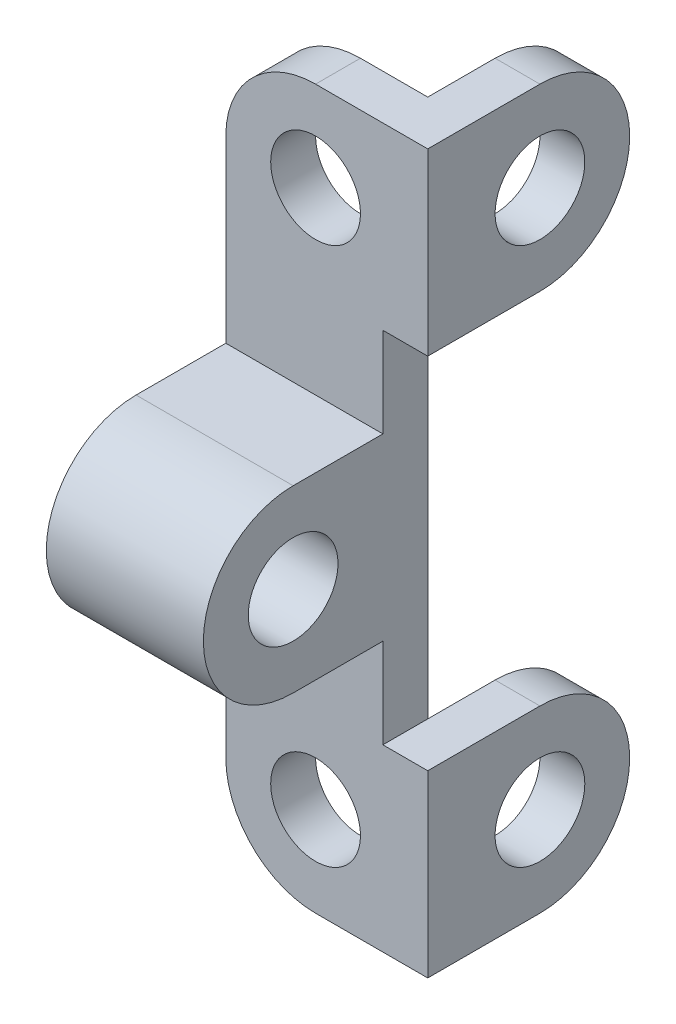
ISO-10303-21;
HEADER;
FILE_DESCRIPTION(('STEP AP214'),'2;1');
FILE_NAME('part.step','',(''),(''),'','','');
FILE_SCHEMA(('AUTOMOTIVE_DESIGN { 1 0 10303 214 1 1 1 1 }'));
ENDSEC;
DATA;
#1=APPLICATION_CONTEXT('core data for automotive mechanical design processes');
#2=APPLICATION_PROTOCOL_DEFINITION('international standard','automotive_design',2000,#1);
#3=PRODUCT_CONTEXT('',#1,'mechanical');
#4=PRODUCT('Part','Part','',(#3));
#5=PRODUCT_RELATED_PRODUCT_CATEGORY('part','',(#4));
#6=PRODUCT_DEFINITION_FORMATION('','',#4);
#7=PRODUCT_DEFINITION_CONTEXT('part definition',#1,'design');
#8=PRODUCT_DEFINITION('design','',#6,#7);
#9=PRODUCT_DEFINITION_SHAPE('','',#8);
#10=(LENGTH_UNIT() NAMED_UNIT(*) SI_UNIT(.MILLI.,.METRE.));
#11=(NAMED_UNIT(*) PLANE_ANGLE_UNIT() SI_UNIT($,.RADIAN.));
#12=(NAMED_UNIT(*) SI_UNIT($,.STERADIAN.) SOLID_ANGLE_UNIT());
#13=UNCERTAINTY_MEASURE_WITH_UNIT(LENGTH_MEASURE(1.E-05),#10,'distance_accuracy_value','');
#14=(GEOMETRIC_REPRESENTATION_CONTEXT(3) GLOBAL_UNCERTAINTY_ASSIGNED_CONTEXT((#13)) GLOBAL_UNIT_ASSIGNED_CONTEXT((#10,
#11,#12)) REPRESENTATION_CONTEXT('',''));
#15=CARTESIAN_POINT('',(0.,0.,0.));
#16=DIRECTION('',(0.,0.,1.));
#17=DIRECTION('',(1.,0.,0.));
#18=AXIS2_PLACEMENT_3D('',#15,#16,#17);
#19=CARTESIAN_POINT('',(-20.,0.,-30.));
#20=DIRECTION('',(0.,0.,-1.));
#21=DIRECTION('',(-1.,0.,0.));
#22=AXIS2_PLACEMENT_3D('',#19,#20,#21);
#23=PLANE('',#22);
#24=CARTESIAN_POINT('',(0.,-60.,-30.));
#25=DIRECTION('',(0.,0.,-1.));
#26=DIRECTION('',(-1.,0.,0.));
#27=AXIS2_PLACEMENT_3D('',#24,#25,#26);
#28=CIRCLE('',#27,10.);
#29=CARTESIAN_POINT('',(-10.,-60.,-30.));
#30=VERTEX_POINT('',#29);
#31=EDGE_CURVE('E314',#30,#30,#28,.T.);
#32=ORIENTED_EDGE('',*,*,#31,.F.);
#33=EDGE_LOOP('',(#32));
#34=FACE_BOUND('',#33,.T.);
#35=CARTESIAN_POINT('',(0.,60.,-30.));
#36=DIRECTION('',(0.,0.,-1.));
#37=DIRECTION('',(-1.,0.,0.));
#38=AXIS2_PLACEMENT_3D('',#35,#36,#37);
#39=CIRCLE('',#38,10.);
#40=CARTESIAN_POINT('',(-10.,60.,-30.));
#41=VERTEX_POINT('',#40);
#42=EDGE_CURVE('E203',#41,#41,#39,.T.);
#43=ORIENTED_EDGE('',*,*,#42,.F.);
#44=EDGE_LOOP('',(#43));
#45=FACE_BOUND('',#44,.T.);
#46=DIRECTION('',(0.,1.,0.));
#47=VECTOR('',#46,1.);
#48=CARTESIAN_POINT('',(15.,0.,-30.));
#49=LINE('',#48,#47);
#50=CARTESIAN_POINT('',(15.,-40.,-30.));
#51=VERTEX_POINT('',#50);
#52=CARTESIAN_POINT('',(15.,40.,-30.));
#53=VERTEX_POINT('',#52);
#54=EDGE_CURVE('E280',#51,#53,#49,.T.);
#55=ORIENTED_EDGE('',*,*,#54,.F.);
#56=DIRECTION('',(0.,-1.,0.));
#57=VECTOR('',#56,1.);
#58=CARTESIAN_POINT('',(15.,0.,-30.));
#59=LINE('',#58,#57);
#60=CARTESIAN_POINT('',(15.,-80.,-30.));
#61=VERTEX_POINT('',#60);
#62=EDGE_CURVE('E194',#51,#61,#59,.T.);
#63=ORIENTED_EDGE('',*,*,#62,.T.);
#64=DIRECTION('',(1.,0.,0.));
#65=VECTOR('',#64,1.);
#66=CARTESIAN_POINT('',(-20.,-80.,-30.));
#67=LINE('',#66,#65);
#68=CARTESIAN_POINT('',(0.,-80.,-30.));
#69=VERTEX_POINT('',#68);
#70=EDGE_CURVE('E169',#69,#61,#67,.T.);
#71=ORIENTED_EDGE('',*,*,#70,.F.);
#72=CARTESIAN_POINT('',(0.,-60.,-30.));
#73=DIRECTION('',(0.,0.,-1.));
#74=DIRECTION('',(-1.,0.,0.));
#75=AXIS2_PLACEMENT_3D('',#72,#73,#74);
#76=CIRCLE('',#75,20.);
#77=CARTESIAN_POINT('',(-20.,-60.,-30.));
#78=VERTEX_POINT('',#77);
#79=EDGE_CURVE('E308',#69,#78,#76,.T.);
#80=ORIENTED_EDGE('',*,*,#79,.T.);
#81=DIRECTION('',(0.,1.,0.));
#82=VECTOR('',#81,1.);
#83=CARTESIAN_POINT('',(-20.,0.,-30.));
#84=LINE('',#83,#82);
#85=CARTESIAN_POINT('',(-20.,60.,-30.));
#86=VERTEX_POINT('',#85);
#87=EDGE_CURVE('E285',#78,#86,#84,.T.);
#88=ORIENTED_EDGE('',*,*,#87,.T.);
#89=CARTESIAN_POINT('',(0.,60.,-30.));
#90=DIRECTION('',(0.,0.,-1.));
#91=DIRECTION('',(-1.,0.,0.));
#92=AXIS2_PLACEMENT_3D('',#89,#90,#91);
#93=CIRCLE('',#92,20.);
#94=CARTESIAN_POINT('',(0.,80.,-30.));
#95=VERTEX_POINT('',#94);
#96=EDGE_CURVE('E310',#86,#95,#93,.T.);
#97=ORIENTED_EDGE('',*,*,#96,.T.);
#98=DIRECTION('',(1.,0.,0.));
#99=VECTOR('',#98,1.);
#100=CARTESIAN_POINT('',(-20.,80.,-30.));
#101=LINE('',#100,#99);
#102=CARTESIAN_POINT('',(15.,80.,-30.));
#103=VERTEX_POINT('',#102);
#104=EDGE_CURVE('E291',#95,#103,#101,.T.);
#105=ORIENTED_EDGE('',*,*,#104,.T.);
#106=DIRECTION('',(0.,1.,0.));
#107=VECTOR('',#106,1.);
#108=CARTESIAN_POINT('',(15.,0.,-30.));
#109=LINE('',#108,#107);
#110=EDGE_CURVE('E222',#53,#103,#109,.T.);
#111=ORIENTED_EDGE('',*,*,#110,.F.);
#112=EDGE_LOOP('',(#55,#63,#71,#80,#88,#97,#105,#111));
#113=FACE_BOUND('',#112,.T.);
#114=ADVANCED_FACE('F39',(#34,#45,#113),#23,.T.);
#115=CARTESIAN_POINT('',(-20.,0.,-20.));
#116=DIRECTION('',(0.,0.,-1.));
#117=DIRECTION('',(-1.,0.,0.));
#118=AXIS2_PLACEMENT_3D('',#115,#116,#117);
#119=PLANE('',#118);
#120=CARTESIAN_POINT('',(0.,60.,-20.));
#121=DIRECTION('',(0.,0.,-1.));
#122=DIRECTION('',(-1.,0.,0.));
#123=AXIS2_PLACEMENT_3D('',#120,#121,#122);
#124=CIRCLE('',#123,10.);
#125=CARTESIAN_POINT('',(-10.,60.,-20.));
#126=VERTEX_POINT('',#125);
#127=EDGE_CURVE('E43',#126,#126,#124,.T.);
#128=ORIENTED_EDGE('',*,*,#127,.T.);
#129=EDGE_LOOP('',(#128));
#130=FACE_BOUND('',#129,.T.);
#131=DIRECTION('',(0.,1.,0.));
#132=VECTOR('',#131,1.);
#133=CARTESIAN_POINT('',(15.,0.,-20.));
#134=LINE('',#133,#132);
#135=CARTESIAN_POINT('',(15.,20.,-20.));
#136=VERTEX_POINT('',#135);
#137=CARTESIAN_POINT('',(15.,40.,-20.));
#138=VERTEX_POINT('',#137);
#139=EDGE_CURVE('E282',#136,#138,#134,.T.);
#140=ORIENTED_EDGE('',*,*,#139,.T.);
#141=DIRECTION('',(-1.,0.,0.));
#142=VECTOR('',#141,1.);
#143=CARTESIAN_POINT('',(25.,40.,-20.));
#144=LINE('',#143,#142);
#145=CARTESIAN_POINT('',(25.,40.,-20.));
#146=VERTEX_POINT('',#145);
#147=EDGE_CURVE('E224',#146,#138,#144,.T.);
#148=ORIENTED_EDGE('',*,*,#147,.F.);
#149=DIRECTION('',(0.,-1.,0.));
#150=VECTOR('',#149,1.);
#151=CARTESIAN_POINT('',(25.,80.,-20.));
#152=LINE('',#151,#150);
#153=CARTESIAN_POINT('',(25.,80.,-20.));
#154=VERTEX_POINT('',#153);
#155=EDGE_CURVE('E245',#154,#146,#152,.T.);
#156=ORIENTED_EDGE('',*,*,#155,.F.);
#157=DIRECTION('',(1.,0.,0.));
#158=VECTOR('',#157,1.);
#159=CARTESIAN_POINT('',(-20.,80.,-20.));
#160=LINE('',#159,#158);
#161=CARTESIAN_POINT('',(0.,80.,-20.));
#162=VERTEX_POINT('',#161);
#163=EDGE_CURVE('E296',#162,#154,#160,.T.);
#164=ORIENTED_EDGE('',*,*,#163,.F.);
#165=CARTESIAN_POINT('',(0.,60.,-20.));
#166=DIRECTION('',(0.,0.,-1.));
#167=DIRECTION('',(-1.,0.,0.));
#168=AXIS2_PLACEMENT_3D('',#165,#166,#167);
#169=CIRCLE('',#168,20.);
#170=CARTESIAN_POINT('',(-20.,60.,-20.));
#171=VERTEX_POINT('',#170);
#172=EDGE_CURVE('E302',#162,#171,#169,.F.);
#173=ORIENTED_EDGE('',*,*,#172,.T.);
#174=DIRECTION('',(0.,1.,0.));
#175=VECTOR('',#174,1.);
#176=CARTESIAN_POINT('',(-20.,0.,-20.));
#177=LINE('',#176,#175);
#178=CARTESIAN_POINT('',(-20.,20.,-20.));
#179=VERTEX_POINT('',#178);
#180=EDGE_CURVE('E288',#179,#171,#177,.T.);
#181=ORIENTED_EDGE('',*,*,#180,.F.);
#182=DIRECTION('',(-1.,0.,0.));
#183=VECTOR('',#182,1.);
#184=CARTESIAN_POINT('',(15.,20.,-20.));
#185=LINE('',#184,#183);
#186=EDGE_CURVE('E271',#136,#179,#185,.T.);
#187=ORIENTED_EDGE('',*,*,#186,.F.);
#188=EDGE_LOOP('',(#140,#148,#156,#164,#173,#181,#187));
#189=FACE_BOUND('',#188,.T.);
#190=ADVANCED_FACE('F349',(#130,#189),#119,.F.);
#191=CARTESIAN_POINT('',(0.,-60.,-20.));
#192=DIRECTION('',(0.,0.,-1.));
#193=DIRECTION('',(-1.,0.,0.));
#194=AXIS2_PLACEMENT_3D('',#191,#192,#193);
#195=CIRCLE('',#194,10.);
#196=CARTESIAN_POINT('',(-10.,-60.,-20.));
#197=VERTEX_POINT('',#196);
#198=EDGE_CURVE('E312',#197,#197,#195,.T.);
#199=ORIENTED_EDGE('',*,*,#198,.T.);
#200=EDGE_LOOP('',(#199));
#201=FACE_BOUND('',#200,.T.);
#202=DIRECTION('',(-1.,0.,0.));
#203=VECTOR('',#202,1.);
#204=CARTESIAN_POINT('',(25.,-40.,-20.));
#205=LINE('',#204,#203);
#206=CARTESIAN_POINT('',(25.,-40.,-20.));
#207=VERTEX_POINT('',#206);
#208=CARTESIAN_POINT('',(15.,-40.,-20.));
#209=VERTEX_POINT('',#208);
#210=EDGE_CURVE('E233',#207,#209,#205,.T.);
#211=ORIENTED_EDGE('',*,*,#210,.T.);
#212=CARTESIAN_POINT('',(15.,-20.,-20.));
#213=VERTEX_POINT('',#212);
#214=EDGE_CURVE('E283',#209,#213,#134,.T.);
#215=ORIENTED_EDGE('',*,*,#214,.T.);
#216=DIRECTION('',(-1.,0.,0.));
#217=VECTOR('',#216,1.);
#218=CARTESIAN_POINT('',(15.,-20.,-20.));
#219=LINE('',#218,#217);
#220=CARTESIAN_POINT('',(-20.,-20.,-20.));
#221=VERTEX_POINT('',#220);
#222=EDGE_CURVE('E273',#213,#221,#219,.T.);
#223=ORIENTED_EDGE('',*,*,#222,.T.);
#224=CARTESIAN_POINT('',(-20.,-60.,-20.));
#225=VERTEX_POINT('',#224);
#226=EDGE_CURVE('E289',#225,#221,#177,.T.);
#227=ORIENTED_EDGE('',*,*,#226,.F.);
#228=CARTESIAN_POINT('',(0.,-60.,-20.));
#229=DIRECTION('',(0.,0.,-1.));
#230=DIRECTION('',(-1.,0.,0.));
#231=AXIS2_PLACEMENT_3D('',#228,#229,#230);
#232=CIRCLE('',#231,20.);
#233=CARTESIAN_POINT('',(0.,-80.,-20.));
#234=VERTEX_POINT('',#233);
#235=EDGE_CURVE('E11',#225,#234,#232,.F.);
#236=ORIENTED_EDGE('',*,*,#235,.T.);
#237=DIRECTION('',(1.,0.,0.));
#238=VECTOR('',#237,1.);
#239=CARTESIAN_POINT('',(-20.,-80.,-20.));
#240=LINE('',#239,#238);
#241=CARTESIAN_POINT('',(25.,-80.,-20.));
#242=VERTEX_POINT('',#241);
#243=EDGE_CURVE('E294',#234,#242,#240,.T.);
#244=ORIENTED_EDGE('',*,*,#243,.T.);
#245=DIRECTION('',(0.,-1.,0.));
#246=VECTOR('',#245,1.);
#247=CARTESIAN_POINT('',(25.,-80.,-20.));
#248=LINE('',#247,#246);
#249=EDGE_CURVE('E230',#207,#242,#248,.T.);
#250=ORIENTED_EDGE('',*,*,#249,.F.);
#251=EDGE_LOOP('',(#211,#215,#223,#227,#236,#244,#250));
#252=FACE_BOUND('',#251,.T.);
#253=ADVANCED_FACE('F356',(#201,#252),#119,.F.);
#254=CARTESIAN_POINT('',(-20.,-80.,0.));
#255=DIRECTION('',(0.,-1.,0.));
#256=DIRECTION('',(0.,0.,-1.));
#257=AXIS2_PLACEMENT_3D('',#254,#255,#256);
#258=PLANE('',#257);
#259=DIRECTION('',(0.,0.,-1.));
#260=VECTOR('',#259,1.);
#261=CARTESIAN_POINT('',(25.,-80.,-20.));
#262=LINE('',#261,#260);
#263=CARTESIAN_POINT('',(25.,-80.,-45.));
#264=VERTEX_POINT('',#263);
#265=EDGE_CURVE('E225',#242,#264,#262,.T.);
#266=ORIENTED_EDGE('',*,*,#265,.F.);
#267=ORIENTED_EDGE('',*,*,#243,.F.);
#268=DIRECTION('',(0.,0.,-1.));
#269=VECTOR('',#268,1.);
#270=CARTESIAN_POINT('',(0.,-80.,-30.));
#271=LINE('',#270,#269);
#272=EDGE_CURVE('E48',#234,#69,#271,.T.);
#273=ORIENTED_EDGE('',*,*,#272,.T.);
#274=ORIENTED_EDGE('',*,*,#70,.T.);
#275=DIRECTION('',(0.,0.,-1.));
#276=VECTOR('',#275,1.);
#277=CARTESIAN_POINT('',(15.,-80.,-45.));
#278=LINE('',#277,#276);
#279=CARTESIAN_POINT('',(15.,-80.,-45.));
#280=VERTEX_POINT('',#279);
#281=EDGE_CURVE('E161',#61,#280,#278,.T.);
#282=ORIENTED_EDGE('',*,*,#281,.T.);
#283=DIRECTION('',(1.,0.,0.));
#284=VECTOR('',#283,1.);
#285=CARTESIAN_POINT('',(15.,-80.,-45.));
#286=LINE('',#285,#284);
#287=EDGE_CURVE('E165',#280,#264,#286,.T.);
#288=ORIENTED_EDGE('',*,*,#287,.T.);
#289=EDGE_LOOP('',(#266,#267,#273,#274,#282,#288));
#290=FACE_BOUND('',#289,.T.);
#291=ADVANCED_FACE('F164',(#290),#258,.T.);
#292=CARTESIAN_POINT('',(-20.,80.,0.));
#293=DIRECTION('',(0.,1.,0.));
#294=DIRECTION('',(0.,0.,1.));
#295=AXIS2_PLACEMENT_3D('',#292,#293,#294);
#296=PLANE('',#295);
#297=ORIENTED_EDGE('',*,*,#163,.T.);
#298=DIRECTION('',(0.,0.,1.));
#299=VECTOR('',#298,1.);
#300=CARTESIAN_POINT('',(25.,80.,-20.));
#301=LINE('',#300,#299);
#302=CARTESIAN_POINT('',(25.,80.,-45.));
#303=VERTEX_POINT('',#302);
#304=EDGE_CURVE('E243',#303,#154,#301,.T.);
#305=ORIENTED_EDGE('',*,*,#304,.F.);
#306=DIRECTION('',(1.,0.,0.));
#307=VECTOR('',#306,1.);
#308=CARTESIAN_POINT('',(15.,80.,-45.));
#309=LINE('',#308,#307);
#310=CARTESIAN_POINT('',(15.,80.,-45.));
#311=VERTEX_POINT('',#310);
#312=EDGE_CURVE('E196',#311,#303,#309,.T.);
#313=ORIENTED_EDGE('',*,*,#312,.F.);
#314=DIRECTION('',(0.,0.,1.));
#315=VECTOR('',#314,1.);
#316=CARTESIAN_POINT('',(15.,80.,-45.));
#317=LINE('',#316,#315);
#318=EDGE_CURVE('E210',#311,#103,#317,.T.);
#319=ORIENTED_EDGE('',*,*,#318,.T.);
#320=ORIENTED_EDGE('',*,*,#104,.F.);
#321=DIRECTION('',(0.,0.,1.));
#322=VECTOR('',#321,1.);
#323=CARTESIAN_POINT('',(0.,80.,-20.));
#324=LINE('',#323,#322);
#325=EDGE_CURVE('E293',#95,#162,#324,.T.);
#326=ORIENTED_EDGE('',*,*,#325,.T.);
#327=EDGE_LOOP('',(#297,#305,#313,#319,#320,#326));
#328=FACE_BOUND('',#327,.T.);
#329=ADVANCED_FACE('F361',(#328),#296,.T.);
#330=CARTESIAN_POINT('',(-20.,0.,0.));
#331=DIRECTION('',(1.,0.,0.));
#332=DIRECTION('',(0.,0.,-1.));
#333=AXIS2_PLACEMENT_3D('',#330,#331,#332);
#334=PLANE('',#333);
#335=ORIENTED_EDGE('',*,*,#180,.T.);
#336=DIRECTION('',(0.,0.,1.));
#337=VECTOR('',#336,1.);
#338=CARTESIAN_POINT('',(-20.,60.,-30.));
#339=LINE('',#338,#337);
#340=EDGE_CURVE('E306',#171,#86,#339,.F.);
#341=ORIENTED_EDGE('',*,*,#340,.T.);
#342=ORIENTED_EDGE('',*,*,#87,.F.);
#343=DIRECTION('',(0.,0.,-1.));
#344=VECTOR('',#343,1.);
#345=CARTESIAN_POINT('',(-20.,-60.,-20.));
#346=LINE('',#345,#344);
#347=EDGE_CURVE('E304',#78,#225,#346,.F.);
#348=ORIENTED_EDGE('',*,*,#347,.T.);
#349=ORIENTED_EDGE('',*,*,#226,.T.);
#350=DIRECTION('',(0.,0.,-1.));
#351=VECTOR('',#350,1.);
#352=CARTESIAN_POINT('',(-20.,-20.,0.));
#353=LINE('',#352,#351);
#354=CARTESIAN_POINT('',(-20.,-20.,0.));
#355=VERTEX_POINT('',#354);
#356=EDGE_CURVE('E257',#355,#221,#353,.T.);
#357=ORIENTED_EDGE('',*,*,#356,.F.);
#358=CARTESIAN_POINT('',(-20.,0.,0.));
#359=DIRECTION('',(1.,0.,0.));
#360=DIRECTION('',(0.,0.,-1.));
#361=AXIS2_PLACEMENT_3D('',#358,#359,#360);
#362=CIRCLE('',#361,20.);
#363=CARTESIAN_POINT('',(-20.,20.,0.));
#364=VERTEX_POINT('',#363);
#365=EDGE_CURVE('E254',#364,#355,#362,.T.);
#366=ORIENTED_EDGE('',*,*,#365,.F.);
#367=DIRECTION('',(0.,0.,1.));
#368=VECTOR('',#367,1.);
#369=CARTESIAN_POINT('',(-20.,20.,0.));
#370=LINE('',#369,#368);
#371=EDGE_CURVE('E251',#179,#364,#370,.T.);
#372=ORIENTED_EDGE('',*,*,#371,.F.);
#373=EDGE_LOOP('',(#335,#341,#342,#348,#349,#357,#366,#372));
#374=FACE_BOUND('',#373,.T.);
#375=CARTESIAN_POINT('',(-20.,0.,0.));
#376=DIRECTION('',(1.,0.,0.));
#377=DIRECTION('',(0.,0.,-1.));
#378=AXIS2_PLACEMENT_3D('',#375,#376,#377);
#379=CIRCLE('',#378,10.);
#380=CARTESIAN_POINT('',(-20.,0.,-10.));
#381=VERTEX_POINT('',#380);
#382=EDGE_CURVE('E238',#381,#381,#379,.T.);
#383=ORIENTED_EDGE('',*,*,#382,.T.);
#384=EDGE_LOOP('',(#383));
#385=FACE_BOUND('',#384,.T.);
#386=ADVANCED_FACE('F402',(#374,#385),#334,.F.);
#387=CARTESIAN_POINT('',(15.,0.,0.));
#388=DIRECTION('',(1.,0.,0.));
#389=DIRECTION('',(0.,0.,-1.));
#390=AXIS2_PLACEMENT_3D('',#387,#388,#389);
#391=PLANE('',#390);
#392=DIRECTION('',(0.,0.,1.));
#393=VECTOR('',#392,1.);
#394=CARTESIAN_POINT('',(15.,-40.,-20.));
#395=LINE('',#394,#393);
#396=EDGE_CURVE('E228',#51,#209,#395,.T.);
#397=ORIENTED_EDGE('',*,*,#396,.F.);
#398=ORIENTED_EDGE('',*,*,#54,.T.);
#399=DIRECTION('',(0.,0.,-1.));
#400=VECTOR('',#399,1.);
#401=CARTESIAN_POINT('',(15.,40.,-20.));
#402=LINE('',#401,#400);
#403=EDGE_CURVE('E56',#138,#53,#402,.T.);
#404=ORIENTED_EDGE('',*,*,#403,.F.);
#405=ORIENTED_EDGE('',*,*,#139,.F.);
#406=DIRECTION('',(0.,0.,1.));
#407=VECTOR('',#406,1.);
#408=CARTESIAN_POINT('',(15.,20.,0.));
#409=LINE('',#408,#407);
#410=CARTESIAN_POINT('',(15.,20.,0.));
#411=VERTEX_POINT('',#410);
#412=EDGE_CURVE('E263',#136,#411,#409,.T.);
#413=ORIENTED_EDGE('',*,*,#412,.T.);
#414=CARTESIAN_POINT('',(15.,0.,0.));
#415=DIRECTION('',(1.,0.,0.));
#416=DIRECTION('',(0.,0.,-1.));
#417=AXIS2_PLACEMENT_3D('',#414,#415,#416);
#418=CIRCLE('',#417,20.);
#419=CARTESIAN_POINT('',(15.,-20.,0.));
#420=VERTEX_POINT('',#419);
#421=EDGE_CURVE('E266',#411,#420,#418,.T.);
#422=ORIENTED_EDGE('',*,*,#421,.T.);
#423=DIRECTION('',(0.,0.,-1.));
#424=VECTOR('',#423,1.);
#425=CARTESIAN_POINT('',(15.,-20.,0.));
#426=LINE('',#425,#424);
#427=EDGE_CURVE('E268',#420,#213,#426,.T.);
#428=ORIENTED_EDGE('',*,*,#427,.T.);
#429=ORIENTED_EDGE('',*,*,#214,.F.);
#430=EDGE_LOOP('',(#397,#398,#404,#405,#413,#422,#428,#429));
#431=FACE_BOUND('',#430,.T.);
#432=CARTESIAN_POINT('',(15.,0.,0.));
#433=DIRECTION('',(1.,0.,0.));
#434=DIRECTION('',(0.,0.,-1.));
#435=AXIS2_PLACEMENT_3D('',#432,#433,#434);
#436=CIRCLE('',#435,10.);
#437=CARTESIAN_POINT('',(15.,0.,-10.));
#438=VERTEX_POINT('',#437);
#439=EDGE_CURVE('E260',#438,#438,#436,.T.);
#440=ORIENTED_EDGE('',*,*,#439,.F.);
#441=EDGE_LOOP('',(#440));
#442=FACE_BOUND('',#441,.T.);
#443=ADVANCED_FACE('F394',(#431,#442),#391,.T.);
#444=CARTESIAN_POINT('',(15.,20.,0.));
#445=DIRECTION('',(0.,-1.,0.));
#446=DIRECTION('',(0.,0.,-1.));
#447=AXIS2_PLACEMENT_3D('',#444,#445,#446);
#448=PLANE('',#447);
#449=ORIENTED_EDGE('',*,*,#186,.T.);
#450=ORIENTED_EDGE('',*,*,#371,.T.);
#451=DIRECTION('',(-1.,0.,0.));
#452=VECTOR('',#451,1.);
#453=CARTESIAN_POINT('',(15.,20.,0.));
#454=LINE('',#453,#452);
#455=EDGE_CURVE('E278',#411,#364,#454,.T.);
#456=ORIENTED_EDGE('',*,*,#455,.F.);
#457=ORIENTED_EDGE('',*,*,#412,.F.);
#458=EDGE_LOOP('',(#449,#450,#456,#457));
#459=FACE_BOUND('',#458,.T.);
#460=ADVANCED_FACE('F416',(#459),#448,.F.);
#461=CARTESIAN_POINT('',(15.,0.,0.));
#462=DIRECTION('',(-1.,0.,0.));
#463=DIRECTION('',(0.,0.,1.));
#464=AXIS2_PLACEMENT_3D('',#461,#462,#463);
#465=CYLINDRICAL_SURFACE('',#464,20.);
#466=ORIENTED_EDGE('',*,*,#455,.T.);
#467=ORIENTED_EDGE('',*,*,#365,.T.);
#468=DIRECTION('',(-1.,0.,0.));
#469=VECTOR('',#468,1.);
#470=CARTESIAN_POINT('',(15.,-20.,0.));
#471=LINE('',#470,#469);
#472=EDGE_CURVE('E276',#420,#355,#471,.T.);
#473=ORIENTED_EDGE('',*,*,#472,.F.);
#474=ORIENTED_EDGE('',*,*,#421,.F.);
#475=EDGE_LOOP('',(#466,#467,#473,#474));
#476=FACE_BOUND('',#475,.T.);
#477=ADVANCED_FACE('F418',(#476),#465,.T.);
#478=CARTESIAN_POINT('',(15.,-20.,0.));
#479=DIRECTION('',(0.,1.,0.));
#480=DIRECTION('',(0.,0.,1.));
#481=AXIS2_PLACEMENT_3D('',#478,#479,#480);
#482=PLANE('',#481);
#483=ORIENTED_EDGE('',*,*,#472,.T.);
#484=ORIENTED_EDGE('',*,*,#356,.T.);
#485=ORIENTED_EDGE('',*,*,#222,.F.);
#486=ORIENTED_EDGE('',*,*,#427,.F.);
#487=EDGE_LOOP('',(#483,#484,#485,#486));
#488=FACE_BOUND('',#487,.T.);
#489=ADVANCED_FACE('F373',(#488),#482,.F.);
#490=CARTESIAN_POINT('',(15.,0.,0.));
#491=DIRECTION('',(-1.,0.,0.));
#492=DIRECTION('',(0.,0.,1.));
#493=AXIS2_PLACEMENT_3D('',#490,#491,#492);
#494=CYLINDRICAL_SURFACE('',#493,10.);
#495=ORIENTED_EDGE('',*,*,#439,.T.);
#496=EDGE_LOOP('',(#495));
#497=FACE_BOUND('',#496,.T.);
#498=ORIENTED_EDGE('',*,*,#382,.F.);
#499=EDGE_LOOP('',(#498));
#500=FACE_BOUND('',#499,.T.);
#501=ADVANCED_FACE('F364',(#497,#500),#494,.F.);
#502=CARTESIAN_POINT('',(0.,60.,0.));
#503=DIRECTION('',(0.,0.,-1.));
#504=DIRECTION('',(-1.,0.,0.));
#505=AXIS2_PLACEMENT_3D('',#502,#503,#504);
#506=CYLINDRICAL_SURFACE('',#505,20.);
#507=ORIENTED_EDGE('',*,*,#96,.F.);
#508=ORIENTED_EDGE('',*,*,#340,.F.);
#509=ORIENTED_EDGE('',*,*,#172,.F.);
#510=ORIENTED_EDGE('',*,*,#325,.F.);
#511=EDGE_LOOP('',(#507,#508,#509,#510));
#512=FACE_BOUND('',#511,.T.);
#513=ADVANCED_FACE('F362',(#512),#506,.T.);
#514=CARTESIAN_POINT('',(0.,-60.,0.));
#515=DIRECTION('',(0.,0.,1.));
#516=DIRECTION('',(1.,0.,0.));
#517=AXIS2_PLACEMENT_3D('',#514,#515,#516);
#518=CYLINDRICAL_SURFACE('',#517,20.);
#519=ORIENTED_EDGE('',*,*,#235,.F.);
#520=ORIENTED_EDGE('',*,*,#347,.F.);
#521=ORIENTED_EDGE('',*,*,#79,.F.);
#522=ORIENTED_EDGE('',*,*,#272,.F.);
#523=EDGE_LOOP('',(#519,#520,#521,#522));
#524=FACE_BOUND('',#523,.T.);
#525=ADVANCED_FACE('F41',(#524),#518,.T.);
#526=CARTESIAN_POINT('',(25.,40.,-20.));
#527=DIRECTION('',(0.,1.,0.));
#528=DIRECTION('',(0.,0.,1.));
#529=AXIS2_PLACEMENT_3D('',#526,#527,#528);
#530=PLANE('',#529);
#531=ORIENTED_EDGE('',*,*,#403,.T.);
#532=DIRECTION('',(0.,0.,-1.));
#533=VECTOR('',#532,1.);
#534=CARTESIAN_POINT('',(15.,40.,-20.));
#535=LINE('',#534,#533);
#536=CARTESIAN_POINT('',(15.,40.,-45.));
#537=VERTEX_POINT('',#536);
#538=EDGE_CURVE('E199',#53,#537,#535,.T.);
#539=ORIENTED_EDGE('',*,*,#538,.T.);
#540=DIRECTION('',(1.,0.,0.));
#541=VECTOR('',#540,1.);
#542=CARTESIAN_POINT('',(15.,40.,-45.));
#543=LINE('',#542,#541);
#544=CARTESIAN_POINT('',(25.,40.,-45.));
#545=VERTEX_POINT('',#544);
#546=EDGE_CURVE('E200',#537,#545,#543,.T.);
#547=ORIENTED_EDGE('',*,*,#546,.T.);
#548=DIRECTION('',(0.,0.,-1.));
#549=VECTOR('',#548,1.);
#550=CARTESIAN_POINT('',(25.,40.,-20.));
#551=LINE('',#550,#549);
#552=EDGE_CURVE('E241',#146,#545,#551,.T.);
#553=ORIENTED_EDGE('',*,*,#552,.F.);
#554=ORIENTED_EDGE('',*,*,#147,.T.);
#555=EDGE_LOOP('',(#531,#539,#547,#553,#554));
#556=FACE_BOUND('',#555,.T.);
#557=ADVANCED_FACE('F370',(#556),#530,.F.);
#558=CARTESIAN_POINT('',(25.,0.,0.));
#559=DIRECTION('',(-1.,0.,0.));
#560=DIRECTION('',(0.,0.,1.));
#561=AXIS2_PLACEMENT_3D('',#558,#559,#560);
#562=PLANE('',#561);
#563=ORIENTED_EDGE('',*,*,#304,.T.);
#564=ORIENTED_EDGE('',*,*,#155,.T.);
#565=ORIENTED_EDGE('',*,*,#552,.T.);
#566=CARTESIAN_POINT('',(25.,60.,-45.));
#567=DIRECTION('',(1.,0.,0.));
#568=DIRECTION('',(0.,0.,1.));
#569=AXIS2_PLACEMENT_3D('',#566,#567,#568);
#570=CIRCLE('',#569,20.);
#571=EDGE_CURVE('E204',#545,#303,#570,.T.);
#572=ORIENTED_EDGE('',*,*,#571,.T.);
#573=EDGE_LOOP('',(#563,#564,#565,#572));
#574=FACE_BOUND('',#573,.T.);
#575=CARTESIAN_POINT('',(25.,60.,-45.));
#576=DIRECTION('',(1.,0.,0.));
#577=DIRECTION('',(0.,0.,1.));
#578=AXIS2_PLACEMENT_3D('',#575,#576,#577);
#579=CIRCLE('',#578,10.);
#580=CARTESIAN_POINT('',(25.,60.,-35.));
#581=VERTEX_POINT('',#580);
#582=EDGE_CURVE('E215',#581,#581,#579,.T.);
#583=ORIENTED_EDGE('',*,*,#582,.F.);
#584=EDGE_LOOP('',(#583));
#585=FACE_BOUND('',#584,.T.);
#586=ADVANCED_FACE('F344',(#574,#585),#562,.F.);
#587=CARTESIAN_POINT('',(25.,-40.,-20.));
#588=DIRECTION('',(0.,-1.,0.));
#589=DIRECTION('',(0.,0.,-1.));
#590=AXIS2_PLACEMENT_3D('',#587,#588,#589);
#591=PLANE('',#590);
#592=ORIENTED_EDGE('',*,*,#396,.T.);
#593=ORIENTED_EDGE('',*,*,#210,.F.);
#594=DIRECTION('',(0.,0.,1.));
#595=VECTOR('',#594,1.);
#596=CARTESIAN_POINT('',(25.,-40.,-20.));
#597=LINE('',#596,#595);
#598=CARTESIAN_POINT('',(25.,-40.,-45.));
#599=VERTEX_POINT('',#598);
#600=EDGE_CURVE('E227',#599,#207,#597,.T.);
#601=ORIENTED_EDGE('',*,*,#600,.F.);
#602=DIRECTION('',(1.,0.,0.));
#603=VECTOR('',#602,1.);
#604=CARTESIAN_POINT('',(15.,-40.,-45.));
#605=LINE('',#604,#603);
#606=CARTESIAN_POINT('',(15.,-40.,-45.));
#607=VERTEX_POINT('',#606);
#608=EDGE_CURVE('E181',#607,#599,#605,.T.);
#609=ORIENTED_EDGE('',*,*,#608,.F.);
#610=DIRECTION('',(0.,0.,1.));
#611=VECTOR('',#610,1.);
#612=CARTESIAN_POINT('',(15.,-40.,-20.));
#613=LINE('',#612,#611);
#614=EDGE_CURVE('E182',#607,#51,#613,.T.);
#615=ORIENTED_EDGE('',*,*,#614,.T.);
#616=EDGE_LOOP('',(#592,#593,#601,#609,#615));
#617=FACE_BOUND('',#616,.T.);
#618=ADVANCED_FACE('F334',(#617),#591,.F.);
#619=CARTESIAN_POINT('',(25.,0.,0.));
#620=DIRECTION('',(1.,0.,0.));
#621=DIRECTION('',(0.,0.,-1.));
#622=AXIS2_PLACEMENT_3D('',#619,#620,#621);
#623=PLANE('',#622);
#624=ORIENTED_EDGE('',*,*,#265,.T.);
#625=CARTESIAN_POINT('',(25.,-60.,-45.));
#626=DIRECTION('',(1.,0.,0.));
#627=DIRECTION('',(0.,0.,-1.));
#628=AXIS2_PLACEMENT_3D('',#625,#626,#627);
#629=CIRCLE('',#628,20.);
#630=EDGE_CURVE('E174',#264,#599,#629,.T.);
#631=ORIENTED_EDGE('',*,*,#630,.T.);
#632=ORIENTED_EDGE('',*,*,#600,.T.);
#633=ORIENTED_EDGE('',*,*,#249,.T.);
#634=EDGE_LOOP('',(#624,#631,#632,#633));
#635=FACE_BOUND('',#634,.T.);
#636=CARTESIAN_POINT('',(25.,-60.,-45.));
#637=DIRECTION('',(1.,0.,0.));
#638=DIRECTION('',(0.,0.,-1.));
#639=AXIS2_PLACEMENT_3D('',#636,#637,#638);
#640=CIRCLE('',#639,10.);
#641=CARTESIAN_POINT('',(25.,-60.,-55.));
#642=VERTEX_POINT('',#641);
#643=EDGE_CURVE('E218',#642,#642,#640,.T.);
#644=ORIENTED_EDGE('',*,*,#643,.F.);
#645=EDGE_LOOP('',(#644));
#646=FACE_BOUND('',#645,.T.);
#647=ADVANCED_FACE('F331',(#635,#646),#623,.T.);
#648=CARTESIAN_POINT('',(15.,60.,-45.));
#649=DIRECTION('',(1.,0.,0.));
#650=DIRECTION('',(0.,0.,-1.));
#651=AXIS2_PLACEMENT_3D('',#648,#649,#650);
#652=CYLINDRICAL_SURFACE('',#651,20.);
#653=ORIENTED_EDGE('',*,*,#571,.F.);
#654=ORIENTED_EDGE('',*,*,#546,.F.);
#655=CARTESIAN_POINT('',(15.,60.,-45.));
#656=DIRECTION('',(1.,0.,0.));
#657=DIRECTION('',(0.,0.,1.));
#658=AXIS2_PLACEMENT_3D('',#655,#656,#657);
#659=CIRCLE('',#658,20.);
#660=EDGE_CURVE('E208',#537,#311,#659,.T.);
#661=ORIENTED_EDGE('',*,*,#660,.T.);
#662=ORIENTED_EDGE('',*,*,#312,.T.);
#663=EDGE_LOOP('',(#653,#654,#661,#662));
#664=FACE_BOUND('',#663,.T.);
#665=ADVANCED_FACE('F333',(#664),#652,.T.);
#666=CARTESIAN_POINT('',(15.,60.,-45.));
#667=DIRECTION('',(-1.,0.,0.));
#668=DIRECTION('',(0.,0.,1.));
#669=AXIS2_PLACEMENT_3D('',#666,#667,#668);
#670=PLANE('',#669);
#671=CARTESIAN_POINT('',(15.,60.,-45.));
#672=DIRECTION('',(1.,0.,0.));
#673=DIRECTION('',(0.,0.,1.));
#674=AXIS2_PLACEMENT_3D('',#671,#672,#673);
#675=CIRCLE('',#674,10.);
#676=CARTESIAN_POINT('',(15.,60.,-35.));
#677=VERTEX_POINT('',#676);
#678=EDGE_CURVE('E207',#677,#677,#675,.T.);
#679=ORIENTED_EDGE('',*,*,#678,.T.);
#680=EDGE_LOOP('',(#679));
#681=FACE_BOUND('',#680,.T.);
#682=ORIENTED_EDGE('',*,*,#538,.F.);
#683=ORIENTED_EDGE('',*,*,#110,.T.);
#684=ORIENTED_EDGE('',*,*,#318,.F.);
#685=ORIENTED_EDGE('',*,*,#660,.F.);
#686=EDGE_LOOP('',(#682,#683,#684,#685));
#687=FACE_BOUND('',#686,.T.);
#688=ADVANCED_FACE('F341',(#681,#687),#670,.T.);
#689=CARTESIAN_POINT('',(15.,60.,-45.));
#690=DIRECTION('',(1.,0.,0.));
#691=DIRECTION('',(0.,0.,-1.));
#692=AXIS2_PLACEMENT_3D('',#689,#690,#691);
#693=CYLINDRICAL_SURFACE('',#692,10.);
#694=ORIENTED_EDGE('',*,*,#678,.F.);
#695=EDGE_LOOP('',(#694));
#696=FACE_BOUND('',#695,.T.);
#697=ORIENTED_EDGE('',*,*,#582,.T.);
#698=EDGE_LOOP('',(#697));
#699=FACE_BOUND('',#698,.T.);
#700=ADVANCED_FACE('F485',(#696,#699),#693,.F.);
#701=CARTESIAN_POINT('',(15.,-60.,-45.));
#702=DIRECTION('',(1.,0.,0.));
#703=DIRECTION('',(0.,0.,-1.));
#704=AXIS2_PLACEMENT_3D('',#701,#702,#703);
#705=CYLINDRICAL_SURFACE('',#704,20.);
#706=ORIENTED_EDGE('',*,*,#630,.F.);
#707=ORIENTED_EDGE('',*,*,#287,.F.);
#708=CARTESIAN_POINT('',(15.,-60.,-45.));
#709=DIRECTION('',(1.,0.,0.));
#710=DIRECTION('',(0.,0.,-1.));
#711=AXIS2_PLACEMENT_3D('',#708,#709,#710);
#712=CIRCLE('',#711,20.);
#713=EDGE_CURVE('E173',#280,#607,#712,.T.);
#714=ORIENTED_EDGE('',*,*,#713,.T.);
#715=ORIENTED_EDGE('',*,*,#608,.T.);
#716=EDGE_LOOP('',(#706,#707,#714,#715));
#717=FACE_BOUND('',#716,.T.);
#718=ADVANCED_FACE('F178',(#717),#705,.T.);
#719=CARTESIAN_POINT('',(15.,-60.,-45.));
#720=DIRECTION('',(1.,0.,0.));
#721=DIRECTION('',(0.,0.,-1.));
#722=AXIS2_PLACEMENT_3D('',#719,#720,#721);
#723=PLANE('',#722);
#724=ORIENTED_EDGE('',*,*,#62,.F.);
#725=ORIENTED_EDGE('',*,*,#614,.F.);
#726=ORIENTED_EDGE('',*,*,#713,.F.);
#727=ORIENTED_EDGE('',*,*,#281,.F.);
#728=EDGE_LOOP('',(#724,#725,#726,#727));
#729=FACE_BOUND('',#728,.T.);
#730=CARTESIAN_POINT('',(15.,-60.,-45.));
#731=DIRECTION('',(1.,0.,0.));
#732=DIRECTION('',(0.,0.,-1.));
#733=AXIS2_PLACEMENT_3D('',#730,#731,#732);
#734=CIRCLE('',#733,10.);
#735=CARTESIAN_POINT('',(15.,-60.,-55.));
#736=VERTEX_POINT('',#735);
#737=EDGE_CURVE('E193',#736,#736,#734,.T.);
#738=ORIENTED_EDGE('',*,*,#737,.T.);
#739=EDGE_LOOP('',(#738));
#740=FACE_BOUND('',#739,.T.);
#741=ADVANCED_FACE('F185',(#729,#740),#723,.F.);
#742=CARTESIAN_POINT('',(15.,-60.,-45.));
#743=DIRECTION('',(1.,0.,0.));
#744=DIRECTION('',(0.,0.,-1.));
#745=AXIS2_PLACEMENT_3D('',#742,#743,#744);
#746=CYLINDRICAL_SURFACE('',#745,10.);
#747=ORIENTED_EDGE('',*,*,#737,.F.);
#748=EDGE_LOOP('',(#747));
#749=FACE_BOUND('',#748,.T.);
#750=ORIENTED_EDGE('',*,*,#643,.T.);
#751=EDGE_LOOP('',(#750));
#752=FACE_BOUND('',#751,.T.);
#753=ADVANCED_FACE('F329',(#749,#752),#746,.F.);
#754=CARTESIAN_POINT('',(0.,-60.,-65.));
#755=DIRECTION('',(0.,0.,1.));
#756=DIRECTION('',(1.,0.,0.));
#757=AXIS2_PLACEMENT_3D('',#754,#755,#756);
#758=CYLINDRICAL_SURFACE('',#757,10.);
#759=ORIENTED_EDGE('',*,*,#31,.T.);
#760=EDGE_LOOP('',(#759));
#761=FACE_BOUND('',#760,.T.);
#762=ORIENTED_EDGE('',*,*,#198,.F.);
#763=EDGE_LOOP('',(#762));
#764=FACE_BOUND('',#763,.T.);
#765=ADVANCED_FACE('F448',(#761,#764),#758,.F.);
#766=CARTESIAN_POINT('',(0.,60.,-65.));
#767=DIRECTION('',(0.,0.,1.));
#768=DIRECTION('',(1.,0.,0.));
#769=AXIS2_PLACEMENT_3D('',#766,#767,#768);
#770=CYLINDRICAL_SURFACE('',#769,10.);
#771=ORIENTED_EDGE('',*,*,#42,.T.);
#772=EDGE_LOOP('',(#771));
#773=FACE_BOUND('',#772,.T.);
#774=ORIENTED_EDGE('',*,*,#127,.F.);
#775=EDGE_LOOP('',(#774));
#776=FACE_BOUND('',#775,.T.);
#777=ADVANCED_FACE('F452',(#773,#776),#770,.F.);
#778=CLOSED_SHELL('',(#114,#190,#253,#291,#329,#386,#443,#460,#477,#489,#501,#513,#525,#557,
#586,#618,#647,#665,#688,#700,#718,#741,#753,#765,#777));
#779=MANIFOLD_SOLID_BREP('B2',#778);
#780=ADVANCED_BREP_SHAPE_REPRESENTATION('',(#18,#779),#14);
#781=SHAPE_DEFINITION_REPRESENTATION(#9,#780);
ENDSEC;
END-ISO-10303-21;
